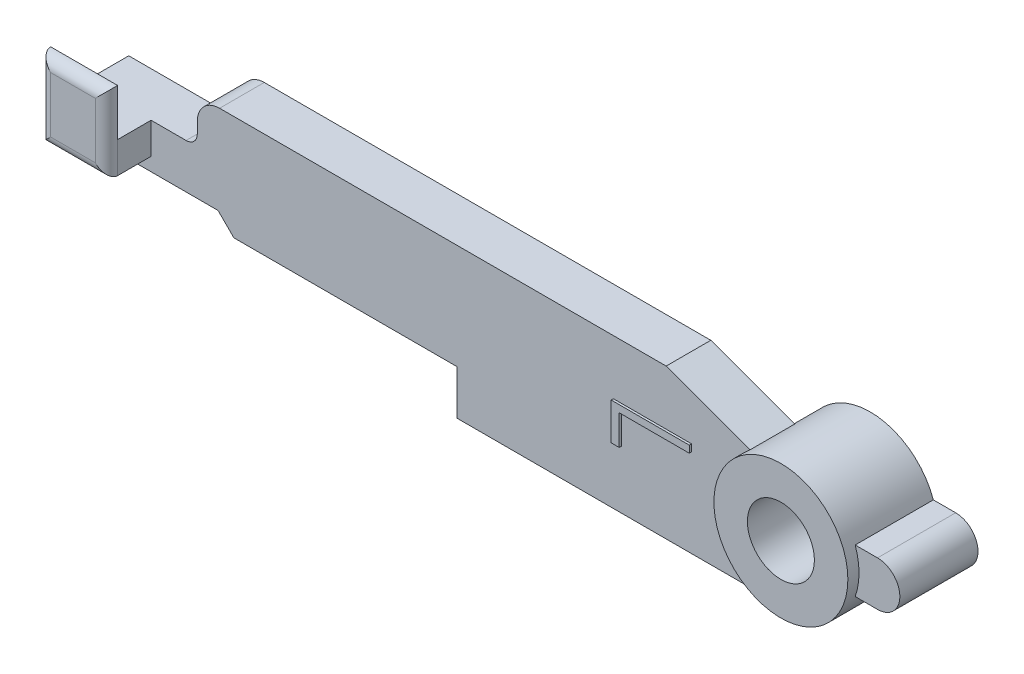
ISO-10303-21;
HEADER;
FILE_DESCRIPTION(('STEP AP214'),'2;1');
FILE_NAME('part.step','',(''),(''),'','','');
FILE_SCHEMA(('AUTOMOTIVE_DESIGN { 1 0 10303 214 1 1 1 1 }'));
ENDSEC;
DATA;
#1=APPLICATION_CONTEXT('core data for automotive mechanical design processes');
#2=APPLICATION_PROTOCOL_DEFINITION('international standard','automotive_design',2000,#1);
#3=PRODUCT_CONTEXT('',#1,'mechanical');
#4=PRODUCT('Part','Part','',(#3));
#5=PRODUCT_RELATED_PRODUCT_CATEGORY('part','',(#4));
#6=PRODUCT_DEFINITION_FORMATION('','',#4);
#7=PRODUCT_DEFINITION_CONTEXT('part definition',#1,'design');
#8=PRODUCT_DEFINITION('design','',#6,#7);
#9=PRODUCT_DEFINITION_SHAPE('','',#8);
#10=(LENGTH_UNIT() NAMED_UNIT(*) SI_UNIT(.MILLI.,.METRE.));
#11=(NAMED_UNIT(*) PLANE_ANGLE_UNIT() SI_UNIT($,.RADIAN.));
#12=(NAMED_UNIT(*) SI_UNIT($,.STERADIAN.) SOLID_ANGLE_UNIT());
#13=UNCERTAINTY_MEASURE_WITH_UNIT(LENGTH_MEASURE(1.E-05),#10,'distance_accuracy_value','');
#14=(GEOMETRIC_REPRESENTATION_CONTEXT(3) GLOBAL_UNCERTAINTY_ASSIGNED_CONTEXT((#13)) GLOBAL_UNIT_ASSIGNED_CONTEXT((#10,
#11,#12)) REPRESENTATION_CONTEXT('',''));
#15=CARTESIAN_POINT('',(0.,0.,0.));
#16=DIRECTION('',(0.,0.,1.));
#17=DIRECTION('',(1.,0.,0.));
#18=AXIS2_PLACEMENT_3D('',#15,#16,#17);
#19=CARTESIAN_POINT('',(15.,-0.500000000000003,-1.5));
#20=DIRECTION('',(0.,0.,1.));
#21=DIRECTION('',(1.,0.,0.));
#22=AXIS2_PLACEMENT_3D('',#19,#20,#21);
#23=CYLINDRICAL_SURFACE('',#22,3.);
#24=CARTESIAN_POINT('',(15.,-0.500000000000003,2.5));
#25=DIRECTION('',(0.,0.,-1.));
#26=DIRECTION('',(1.,0.,0.));
#27=AXIS2_PLACEMENT_3D('',#24,#25,#26);
#28=CIRCLE('',#27,3.);
#29=CARTESIAN_POINT('',(18.,-0.500000000000003,2.5));
#30=VERTEX_POINT('',#29);
#31=EDGE_CURVE('E334',#30,#30,#28,.T.);
#32=ORIENTED_EDGE('',*,*,#31,.T.);
#33=EDGE_LOOP('',(#32));
#34=FACE_BOUND('',#33,.T.);
#35=CARTESIAN_POINT('',(15.,-0.500000000000003,2.));
#36=DIRECTION('',(0.,0.,1.));
#37=DIRECTION('',(-1.,0.,0.));
#38=AXIS2_PLACEMENT_3D('',#35,#36,#37);
#39=CIRCLE('',#38,3.);
#40=CARTESIAN_POINT('',(13.1211883907892,1.83881742277903,2.));
#41=VERTEX_POINT('',#40);
#42=CARTESIAN_POINT('',(15.,-3.5,2.));
#43=VERTEX_POINT('',#42);
#44=EDGE_CURVE('E354',#41,#43,#39,.T.);
#45=ORIENTED_EDGE('',*,*,#44,.T.);
#46=DIRECTION('',(0.,0.,-1.));
#47=VECTOR('',#46,1.);
#48=CARTESIAN_POINT('',(15.,-3.5,2.));
#49=LINE('',#48,#47);
#50=CARTESIAN_POINT('',(15.,-3.5,0.));
#51=VERTEX_POINT('',#50);
#52=EDGE_CURVE('E428',#43,#51,#49,.T.);
#53=ORIENTED_EDGE('',*,*,#52,.T.);
#54=CARTESIAN_POINT('',(15.,-0.500000000000003,0.));
#55=DIRECTION('',(0.,0.,1.));
#56=DIRECTION('',(-1.,0.,0.));
#57=AXIS2_PLACEMENT_3D('',#54,#55,#56);
#58=CIRCLE('',#57,3.);
#59=CARTESIAN_POINT('',(13.1211883907892,1.83881742277903,0.));
#60=VERTEX_POINT('',#59);
#61=EDGE_CURVE('E457',#60,#51,#58,.T.);
#62=ORIENTED_EDGE('',*,*,#61,.F.);
#63=DIRECTION('',(0.,0.,1.));
#64=VECTOR('',#63,1.);
#65=CARTESIAN_POINT('',(13.1211883907892,1.83881742277903,-1.5));
#66=LINE('',#65,#64);
#67=EDGE_CURVE('E351',#60,#41,#66,.T.);
#68=ORIENTED_EDGE('',*,*,#67,.T.);
#69=EDGE_LOOP('',(#45,#53,#62,#68));
#70=FACE_BOUND('',#69,.T.);
#71=CARTESIAN_POINT('',(15.,-0.500000000000003,2.));
#72=DIRECTION('',(0.,0.,1.));
#73=DIRECTION('',(-1.,0.,0.));
#74=AXIS2_PLACEMENT_3D('',#71,#72,#73);
#75=CIRCLE('',#74,3.);
#76=CARTESIAN_POINT('',(17.8284271247462,0.499999999999998,2.));
#77=VERTEX_POINT('',#76);
#78=CARTESIAN_POINT('',(17.8284271247462,-1.5,2.));
#79=VERTEX_POINT('',#78);
#80=EDGE_CURVE('E331',#77,#79,#75,.F.);
#81=ORIENTED_EDGE('',*,*,#80,.F.);
#82=DIRECTION('',(0.,0.,-1.));
#83=VECTOR('',#82,1.);
#84=CARTESIAN_POINT('',(17.8284271247462,0.499999999999998,4.82842712474619));
#85=LINE('',#84,#83);
#86=CARTESIAN_POINT('',(17.8284271247462,0.499999999999998,-1.5));
#87=VERTEX_POINT('',#86);
#88=EDGE_CURVE('E341',#77,#87,#85,.T.);
#89=ORIENTED_EDGE('',*,*,#88,.T.);
#90=CARTESIAN_POINT('',(15.,-0.500000000000003,-1.5));
#91=DIRECTION('',(0.,0.,-1.));
#92=DIRECTION('',(1.,0.,0.));
#93=AXIS2_PLACEMENT_3D('',#90,#91,#92);
#94=CIRCLE('',#93,3.);
#95=CARTESIAN_POINT('',(17.8284271247462,-1.5,-1.5));
#96=VERTEX_POINT('',#95);
#97=EDGE_CURVE('E348',#96,#87,#94,.T.);
#98=ORIENTED_EDGE('',*,*,#97,.F.);
#99=DIRECTION('',(0.,0.,-1.));
#100=VECTOR('',#99,1.);
#101=CARTESIAN_POINT('',(17.8284271247462,-1.5,4.82842712474619));
#102=LINE('',#101,#100);
#103=EDGE_CURVE('E324',#79,#96,#102,.T.);
#104=ORIENTED_EDGE('',*,*,#103,.F.);
#105=EDGE_LOOP('',(#81,#89,#98,#104));
#106=FACE_BOUND('',#105,.T.);
#107=ADVANCED_FACE('F35',(#34,#70,#106),#23,.T.);
#108=CARTESIAN_POINT('',(-16.7071067811866,1.20710678118654,2.));
#109=DIRECTION('',(1.,0.,0.));
#110=DIRECTION('',(0.,0.,-1.));
#111=AXIS2_PLACEMENT_3D('',#108,#109,#110);
#112=PLANE('',#111);
#113=DIRECTION('',(0.,0.,-1.));
#114=VECTOR('',#113,1.);
#115=CARTESIAN_POINT('',(-16.7071067811866,1.20710678118654,2.));
#116=LINE('',#115,#114);
#117=CARTESIAN_POINT('',(-16.7071067811866,1.20710678118654,3.5));
#118=VERTEX_POINT('',#117);
#119=CARTESIAN_POINT('',(-16.7071067811866,1.20710678118654,0.));
#120=VERTEX_POINT('',#119);
#121=EDGE_CURVE('E434',#118,#120,#116,.T.);
#122=ORIENTED_EDGE('',*,*,#121,.T.);
#123=DIRECTION('',(0.,1.,0.));
#124=VECTOR('',#123,1.);
#125=CARTESIAN_POINT('',(-16.7071067811866,1.20710678118654,0.));
#126=LINE('',#125,#124);
#127=CARTESIAN_POINT('',(-16.7071067811866,-0.792893218813459,0.));
#128=VERTEX_POINT('',#127);
#129=EDGE_CURVE('E357',#128,#120,#126,.T.);
#130=ORIENTED_EDGE('',*,*,#129,.F.);
#131=DIRECTION('',(0.,0.,-1.));
#132=VECTOR('',#131,1.);
#133=CARTESIAN_POINT('',(-16.7071067811866,-0.792893218813459,2.));
#134=LINE('',#133,#132);
#135=CARTESIAN_POINT('',(-16.7071067811866,-0.792893218813459,2.));
#136=VERTEX_POINT('',#135);
#137=EDGE_CURVE('E387',#136,#128,#134,.T.);
#138=ORIENTED_EDGE('',*,*,#137,.F.);
#139=DIRECTION('',(0.,1.,0.));
#140=VECTOR('',#139,1.);
#141=CARTESIAN_POINT('',(-16.7071067811866,1.20710678118654,2.));
#142=LINE('',#141,#140);
#143=CARTESIAN_POINT('',(-16.7071067811866,-0.192893218813459,2.));
#144=VERTEX_POINT('',#143);
#145=EDGE_CURVE('E358',#136,#144,#142,.T.);
#146=ORIENTED_EDGE('',*,*,#145,.T.);
#147=DIRECTION('',(0.,0.,-1.));
#148=VECTOR('',#147,1.);
#149=CARTESIAN_POINT('',(-16.7071067811866,-0.192893218813459,4.));
#150=LINE('',#149,#148);
#151=CARTESIAN_POINT('',(-16.7071067811866,-0.192893218813459,3.5));
#152=VERTEX_POINT('',#151);
#153=EDGE_CURVE('E295',#152,#144,#150,.T.);
#154=ORIENTED_EDGE('',*,*,#153,.F.);
#155=DIRECTION('',(0.,-1.,0.));
#156=VECTOR('',#155,1.);
#157=CARTESIAN_POINT('',(-16.7071067811866,-0.192893218813459,3.5));
#158=LINE('',#157,#156);
#159=EDGE_CURVE('E11',#118,#152,#158,.T.);
#160=ORIENTED_EDGE('',*,*,#159,.F.);
#161=EDGE_LOOP('',(#122,#130,#138,#146,#154,#160));
#162=FACE_BOUND('',#161,.T.);
#163=ADVANCED_FACE('F512',(#162),#112,.F.);
#164=CARTESIAN_POINT('',(-11.6381557247154,1.20710678118654,2.));
#165=DIRECTION('',(0.,-1.,0.));
#166=DIRECTION('',(-1.,0.,0.));
#167=AXIS2_PLACEMENT_3D('',#164,#165,#166);
#168=PLANE('',#167);
#169=DIRECTION('',(1.,0.,0.));
#170=VECTOR('',#169,1.);
#171=CARTESIAN_POINT('',(-11.6381557247154,1.20710678118654,0.));
#172=LINE('',#171,#170);
#173=CARTESIAN_POINT('',(-12.1381557247154,1.20710678118654,0.));
#174=VERTEX_POINT('',#173);
#175=EDGE_CURVE('E390',#120,#174,#172,.T.);
#176=ORIENTED_EDGE('',*,*,#175,.F.);
#177=ORIENTED_EDGE('',*,*,#121,.F.);
#178=DIRECTION('',(-1.,0.,0.));
#179=VECTOR('',#178,1.);
#180=CARTESIAN_POINT('',(-13.7071067811866,1.20710678118654,3.5));
#181=LINE('',#180,#179);
#182=CARTESIAN_POINT('',(-13.7071067811866,1.20710678118654,3.5));
#183=VERTEX_POINT('',#182);
#184=EDGE_CURVE('E303',#183,#118,#181,.T.);
#185=ORIENTED_EDGE('',*,*,#184,.F.);
#186=DIRECTION('',(0.,0.,1.));
#187=VECTOR('',#186,1.);
#188=CARTESIAN_POINT('',(-13.7071067811866,1.20710678118654,2.));
#189=LINE('',#188,#187);
#190=CARTESIAN_POINT('',(-13.7071067811866,1.20710678118654,2.));
#191=VERTEX_POINT('',#190);
#192=EDGE_CURVE('E294',#191,#183,#189,.T.);
#193=ORIENTED_EDGE('',*,*,#192,.F.);
#194=DIRECTION('',(1.,0.,0.));
#195=VECTOR('',#194,1.);
#196=CARTESIAN_POINT('',(-11.6381557247154,1.20710678118654,2.));
#197=LINE('',#196,#195);
#198=CARTESIAN_POINT('',(-12.1381557247154,1.20710678118654,2.));
#199=VERTEX_POINT('',#198);
#200=EDGE_CURVE('E361',#191,#199,#197,.T.);
#201=ORIENTED_EDGE('',*,*,#200,.T.);
#202=DIRECTION('',(0.,0.,-1.));
#203=VECTOR('',#202,1.);
#204=CARTESIAN_POINT('',(-12.1381557247154,1.20710678118654,2.));
#205=LINE('',#204,#203);
#206=EDGE_CURVE('E450',#174,#199,#205,.F.);
#207=ORIENTED_EDGE('',*,*,#206,.F.);
#208=EDGE_LOOP('',(#176,#177,#185,#193,#201,#207));
#209=FACE_BOUND('',#208,.T.);
#210=ADVANCED_FACE('F508',(#209),#168,.F.);
#211=CARTESIAN_POINT('',(-11.6381557247154,3.20710678118654,2.));
#212=DIRECTION('',(1.,0.,0.));
#213=DIRECTION('',(0.,-1.,0.));
#214=AXIS2_PLACEMENT_3D('',#211,#212,#213);
#215=PLANE('',#214);
#216=DIRECTION('',(0.,1.,0.));
#217=VECTOR('',#216,1.);
#218=CARTESIAN_POINT('',(-11.6381557247154,3.20710678118654,2.));
#219=LINE('',#218,#217);
#220=CARTESIAN_POINT('',(-11.6381557247154,1.70710678118654,2.));
#221=VERTEX_POINT('',#220);
#222=CARTESIAN_POINT('',(-11.6381557247154,2.20710678118654,2.));
#223=VERTEX_POINT('',#222);
#224=EDGE_CURVE('E365',#221,#223,#219,.T.);
#225=ORIENTED_EDGE('',*,*,#224,.T.);
#226=DIRECTION('',(0.,0.,-1.));
#227=VECTOR('',#226,1.);
#228=CARTESIAN_POINT('',(-11.6381557247154,2.20710678118654,2.));
#229=LINE('',#228,#227);
#230=CARTESIAN_POINT('',(-11.6381557247154,2.20710678118654,0.));
#231=VERTEX_POINT('',#230);
#232=EDGE_CURVE('E442',#231,#223,#229,.F.);
#233=ORIENTED_EDGE('',*,*,#232,.F.);
#234=DIRECTION('',(0.,1.,0.));
#235=VECTOR('',#234,1.);
#236=CARTESIAN_POINT('',(-11.6381557247154,3.20710678118654,0.));
#237=LINE('',#236,#235);
#238=CARTESIAN_POINT('',(-11.6381557247154,1.70710678118654,0.));
#239=VERTEX_POINT('',#238);
#240=EDGE_CURVE('E393',#239,#231,#237,.T.);
#241=ORIENTED_EDGE('',*,*,#240,.F.);
#242=DIRECTION('',(0.,0.,-1.));
#243=VECTOR('',#242,1.);
#244=CARTESIAN_POINT('',(-11.6381557247154,1.70710678118654,0.));
#245=LINE('',#244,#243);
#246=EDGE_CURVE('E447',#221,#239,#245,.T.);
#247=ORIENTED_EDGE('',*,*,#246,.F.);
#248=EDGE_LOOP('',(#225,#233,#241,#247));
#249=FACE_BOUND('',#248,.T.);
#250=ADVANCED_FACE('F555',(#249),#215,.F.);
#251=CARTESIAN_POINT('',(9.36184427528456,3.20710678118654,2.));
#252=DIRECTION('',(0.,-1.,0.));
#253=DIRECTION('',(-1.,0.,0.));
#254=AXIS2_PLACEMENT_3D('',#251,#252,#253);
#255=PLANE('',#254);
#256=DIRECTION('',(1.,0.,0.));
#257=VECTOR('',#256,1.);
#258=CARTESIAN_POINT('',(9.36184427528456,3.20710678118654,2.));
#259=LINE('',#258,#257);
#260=CARTESIAN_POINT('',(-10.6381557247154,3.20710678118654,2.));
#261=VERTEX_POINT('',#260);
#262=CARTESIAN_POINT('',(9.36184427528456,3.20710678118654,2.));
#263=VERTEX_POINT('',#262);
#264=EDGE_CURVE('E368',#261,#263,#259,.T.);
#265=ORIENTED_EDGE('',*,*,#264,.T.);
#266=DIRECTION('',(0.,0.,-1.));
#267=VECTOR('',#266,1.);
#268=CARTESIAN_POINT('',(9.36184427528456,3.20710678118654,2.));
#269=LINE('',#268,#267);
#270=CARTESIAN_POINT('',(9.36184427528456,3.20710678118654,0.));
#271=VERTEX_POINT('',#270);
#272=EDGE_CURVE('E431',#263,#271,#269,.T.);
#273=ORIENTED_EDGE('',*,*,#272,.T.);
#274=DIRECTION('',(1.,0.,0.));
#275=VECTOR('',#274,1.);
#276=CARTESIAN_POINT('',(9.36184427528456,3.20710678118654,0.));
#277=LINE('',#276,#275);
#278=CARTESIAN_POINT('',(-10.6381557247154,3.20710678118654,0.));
#279=VERTEX_POINT('',#278);
#280=EDGE_CURVE('E396',#279,#271,#277,.T.);
#281=ORIENTED_EDGE('',*,*,#280,.F.);
#282=DIRECTION('',(0.,0.,-1.));
#283=VECTOR('',#282,1.);
#284=CARTESIAN_POINT('',(-10.6381557247154,3.20710678118654,2.));
#285=LINE('',#284,#283);
#286=EDGE_CURVE('E437',#261,#279,#285,.T.);
#287=ORIENTED_EDGE('',*,*,#286,.F.);
#288=EDGE_LOOP('',(#265,#273,#281,#287));
#289=FACE_BOUND('',#288,.T.);
#290=ADVANCED_FACE('F548',(#289),#255,.F.);
#291=CARTESIAN_POINT('',(15.,1.15498592123252,2.));
#292=DIRECTION('',(-0.34202014332567,-0.939692620785908,0.));
#293=DIRECTION('',(-0.939692620785908,0.34202014332567,0.));
#294=AXIS2_PLACEMENT_3D('',#291,#292,#293);
#295=PLANE('',#294);
#296=DIRECTION('',(0.939692620785908,-0.34202014332567,0.));
#297=VECTOR('',#296,1.);
#298=CARTESIAN_POINT('',(15.,1.15498592123252,0.));
#299=LINE('',#298,#297);
#300=EDGE_CURVE('E399',#271,#60,#299,.T.);
#301=ORIENTED_EDGE('',*,*,#300,.F.);
#302=ORIENTED_EDGE('',*,*,#272,.F.);
#303=DIRECTION('',(0.939692620785908,-0.34202014332567,0.));
#304=VECTOR('',#303,1.);
#305=CARTESIAN_POINT('',(15.,1.15498592123252,2.));
#306=LINE('',#305,#304);
#307=EDGE_CURVE('E371',#263,#41,#306,.T.);
#308=ORIENTED_EDGE('',*,*,#307,.T.);
#309=ORIENTED_EDGE('',*,*,#67,.F.);
#310=EDGE_LOOP('',(#301,#302,#308,#309));
#311=FACE_BOUND('',#310,.T.);
#312=ADVANCED_FACE('F544',(#311),#295,.F.);
#313=CARTESIAN_POINT('',(0.,-3.5,2.));
#314=DIRECTION('',(0.,1.,0.));
#315=DIRECTION('',(1.,0.,0.));
#316=AXIS2_PLACEMENT_3D('',#313,#314,#315);
#317=PLANE('',#316);
#318=DIRECTION('',(-1.,0.,0.));
#319=VECTOR('',#318,1.);
#320=CARTESIAN_POINT('',(0.,-3.5,0.));
#321=LINE('',#320,#319);
#322=CARTESIAN_POINT('',(0.,-3.5,0.));
#323=VERTEX_POINT('',#322);
#324=EDGE_CURVE('E401',#51,#323,#321,.T.);
#325=ORIENTED_EDGE('',*,*,#324,.F.);
#326=ORIENTED_EDGE('',*,*,#52,.F.);
#327=DIRECTION('',(-1.,0.,0.));
#328=VECTOR('',#327,1.);
#329=CARTESIAN_POINT('',(0.,-3.5,2.));
#330=LINE('',#329,#328);
#331=CARTESIAN_POINT('',(0.,-3.5,2.));
#332=VERTEX_POINT('',#331);
#333=EDGE_CURVE('E373',#43,#332,#330,.T.);
#334=ORIENTED_EDGE('',*,*,#333,.T.);
#335=DIRECTION('',(0.,0.,-1.));
#336=VECTOR('',#335,1.);
#337=CARTESIAN_POINT('',(0.,-3.5,2.));
#338=LINE('',#337,#336);
#339=EDGE_CURVE('E425',#332,#323,#338,.T.);
#340=ORIENTED_EDGE('',*,*,#339,.T.);
#341=EDGE_LOOP('',(#325,#326,#334,#340));
#342=FACE_BOUND('',#341,.T.);
#343=ADVANCED_FACE('F535',(#342),#317,.F.);
#344=CARTESIAN_POINT('',(0.,-1.5,2.));
#345=DIRECTION('',(1.,0.,0.));
#346=DIRECTION('',(0.,-1.,0.));
#347=AXIS2_PLACEMENT_3D('',#344,#345,#346);
#348=PLANE('',#347);
#349=DIRECTION('',(0.,1.,0.));
#350=VECTOR('',#349,1.);
#351=CARTESIAN_POINT('',(0.,-1.5,0.));
#352=LINE('',#351,#350);
#353=CARTESIAN_POINT('',(0.,-1.5,0.));
#354=VERTEX_POINT('',#353);
#355=EDGE_CURVE('E404',#323,#354,#352,.T.);
#356=ORIENTED_EDGE('',*,*,#355,.F.);
#357=ORIENTED_EDGE('',*,*,#339,.F.);
#358=DIRECTION('',(0.,1.,0.));
#359=VECTOR('',#358,1.);
#360=CARTESIAN_POINT('',(0.,-1.5,2.));
#361=LINE('',#360,#359);
#362=CARTESIAN_POINT('',(0.,-1.5,2.));
#363=VERTEX_POINT('',#362);
#364=EDGE_CURVE('E376',#332,#363,#361,.T.);
#365=ORIENTED_EDGE('',*,*,#364,.T.);
#366=DIRECTION('',(0.,0.,-1.));
#367=VECTOR('',#366,1.);
#368=CARTESIAN_POINT('',(0.,-1.5,2.));
#369=LINE('',#368,#367);
#370=EDGE_CURVE('E422',#363,#354,#369,.T.);
#371=ORIENTED_EDGE('',*,*,#370,.T.);
#372=EDGE_LOOP('',(#356,#357,#365,#371));
#373=FACE_BOUND('',#372,.T.);
#374=ADVANCED_FACE('F532',(#373),#348,.F.);
#375=CARTESIAN_POINT('',(-10.,-1.5,2.));
#376=DIRECTION('',(0.,1.,0.));
#377=DIRECTION('',(0.,0.,-1.));
#378=AXIS2_PLACEMENT_3D('',#375,#376,#377);
#379=PLANE('',#378);
#380=DIRECTION('',(-1.,0.,0.));
#381=VECTOR('',#380,1.);
#382=CARTESIAN_POINT('',(-10.,-1.5,0.));
#383=LINE('',#382,#381);
#384=CARTESIAN_POINT('',(-10.,-1.5,0.));
#385=VERTEX_POINT('',#384);
#386=EDGE_CURVE('E407',#354,#385,#383,.T.);
#387=ORIENTED_EDGE('',*,*,#386,.F.);
#388=ORIENTED_EDGE('',*,*,#370,.F.);
#389=DIRECTION('',(-1.,0.,0.));
#390=VECTOR('',#389,1.);
#391=CARTESIAN_POINT('',(-10.,-1.5,2.));
#392=LINE('',#391,#390);
#393=CARTESIAN_POINT('',(-10.,-1.5,2.));
#394=VERTEX_POINT('',#393);
#395=EDGE_CURVE('E379',#363,#394,#392,.T.);
#396=ORIENTED_EDGE('',*,*,#395,.T.);
#397=DIRECTION('',(0.,0.,-1.));
#398=VECTOR('',#397,1.);
#399=CARTESIAN_POINT('',(-10.,-1.5,2.));
#400=LINE('',#399,#398);
#401=EDGE_CURVE('E419',#394,#385,#400,.T.);
#402=ORIENTED_EDGE('',*,*,#401,.T.);
#403=EDGE_LOOP('',(#387,#388,#396,#402));
#404=FACE_BOUND('',#403,.T.);
#405=ADVANCED_FACE('F530',(#404),#379,.F.);
#406=CARTESIAN_POINT('',(-10.7071067811865,-0.792893218813459,2.));
#407=DIRECTION('',(0.707106781186544,0.707106781186551,0.));
#408=DIRECTION('',(0.707106781186551,-0.707106781186544,0.));
#409=AXIS2_PLACEMENT_3D('',#406,#407,#408);
#410=PLANE('',#409);
#411=DIRECTION('',(-0.707106781186551,0.707106781186544,0.));
#412=VECTOR('',#411,1.);
#413=CARTESIAN_POINT('',(-10.7071067811865,-0.792893218813459,0.));
#414=LINE('',#413,#412);
#415=CARTESIAN_POINT('',(-10.7071067811865,-0.792893218813459,0.));
#416=VERTEX_POINT('',#415);
#417=EDGE_CURVE('E410',#385,#416,#414,.T.);
#418=ORIENTED_EDGE('',*,*,#417,.F.);
#419=ORIENTED_EDGE('',*,*,#401,.F.);
#420=DIRECTION('',(-0.707106781186551,0.707106781186544,0.));
#421=VECTOR('',#420,1.);
#422=CARTESIAN_POINT('',(-10.7071067811865,-0.792893218813459,2.));
#423=LINE('',#422,#421);
#424=CARTESIAN_POINT('',(-10.7071067811865,-0.792893218813459,2.));
#425=VERTEX_POINT('',#424);
#426=EDGE_CURVE('E382',#394,#425,#423,.T.);
#427=ORIENTED_EDGE('',*,*,#426,.T.);
#428=DIRECTION('',(0.,0.,-1.));
#429=VECTOR('',#428,1.);
#430=CARTESIAN_POINT('',(-10.7071067811865,-0.792893218813459,2.));
#431=LINE('',#430,#429);
#432=EDGE_CURVE('E416',#425,#416,#431,.T.);
#433=ORIENTED_EDGE('',*,*,#432,.T.);
#434=EDGE_LOOP('',(#418,#419,#427,#433));
#435=FACE_BOUND('',#434,.T.);
#436=ADVANCED_FACE('F526',(#435),#410,.F.);
#437=CARTESIAN_POINT('',(-16.7071067811866,-0.792893218813459,2.));
#438=DIRECTION('',(0.,1.,0.));
#439=DIRECTION('',(1.,0.,0.));
#440=AXIS2_PLACEMENT_3D('',#437,#438,#439);
#441=PLANE('',#440);
#442=DIRECTION('',(-1.,0.,0.));
#443=VECTOR('',#442,1.);
#444=CARTESIAN_POINT('',(-16.7071067811866,-0.792893218813459,0.));
#445=LINE('',#444,#443);
#446=EDGE_CURVE('E362',#416,#128,#445,.T.);
#447=ORIENTED_EDGE('',*,*,#446,.F.);
#448=ORIENTED_EDGE('',*,*,#432,.F.);
#449=DIRECTION('',(-1.,0.,0.));
#450=VECTOR('',#449,1.);
#451=CARTESIAN_POINT('',(-16.7071067811866,-0.792893218813459,2.));
#452=LINE('',#451,#450);
#453=EDGE_CURVE('E385',#425,#136,#452,.T.);
#454=ORIENTED_EDGE('',*,*,#453,.T.);
#455=ORIENTED_EDGE('',*,*,#137,.T.);
#456=EDGE_LOOP('',(#447,#448,#454,#455));
#457=FACE_BOUND('',#456,.T.);
#458=ADVANCED_FACE('F523',(#457),#441,.F.);
#459=CARTESIAN_POINT('',(0.,0.,2.));
#460=DIRECTION('',(0.,0.,-1.));
#461=DIRECTION('',(-1.,0.,0.));
#462=AXIS2_PLACEMENT_3D('',#459,#460,#461);
#463=PLANE('',#462);
#464=DIRECTION('',(0.,1.,0.));
#465=VECTOR('',#464,1.);
#466=CARTESIAN_POINT('',(7.,-0.901867577787817,2.));
#467=LINE('',#466,#465);
#468=CARTESIAN_POINT('',(7.,-0.901867577787817,2.));
#469=VERTEX_POINT('',#468);
#470=CARTESIAN_POINT('',(7.,0.758388832468593,2.));
#471=VERTEX_POINT('',#470);
#472=EDGE_CURVE('E254',#469,#471,#467,.T.);
#473=ORIENTED_EDGE('',*,*,#472,.T.);
#474=DIRECTION('',(1.,0.,0.));
#475=VECTOR('',#474,1.);
#476=CARTESIAN_POINT('',(7.,0.758388832468593,2.));
#477=LINE('',#476,#475);
#478=CARTESIAN_POINT('',(10.5,0.758388832468593,2.));
#479=VERTEX_POINT('',#478);
#480=EDGE_CURVE('E268',#471,#479,#477,.T.);
#481=ORIENTED_EDGE('',*,*,#480,.T.);
#482=DIRECTION('',(0.,-1.,0.));
#483=VECTOR('',#482,1.);
#484=CARTESIAN_POINT('',(10.5,0.758388832468593,2.));
#485=LINE('',#484,#483);
#486=CARTESIAN_POINT('',(10.5,0.444286268366029,2.));
#487=VERTEX_POINT('',#486);
#488=EDGE_CURVE('E233',#479,#487,#485,.T.);
#489=ORIENTED_EDGE('',*,*,#488,.T.);
#490=DIRECTION('',(-1.,0.,0.));
#491=VECTOR('',#490,1.);
#492=CARTESIAN_POINT('',(10.5,0.444286268366029,2.));
#493=LINE('',#492,#491);
#494=CARTESIAN_POINT('',(7.35897435897436,0.444286268366029,2.));
#495=VERTEX_POINT('',#494);
#496=EDGE_CURVE('E52',#487,#495,#493,.T.);
#497=ORIENTED_EDGE('',*,*,#496,.T.);
#498=DIRECTION('',(0.,-1.,0.));
#499=VECTOR('',#498,1.);
#500=CARTESIAN_POINT('',(7.35897435897436,0.444286268366029,2.));
#501=LINE('',#500,#499);
#502=CARTESIAN_POINT('',(7.35897435897436,-0.901867577787817,2.));
#503=VERTEX_POINT('',#502);
#504=EDGE_CURVE('E272',#495,#503,#501,.T.);
#505=ORIENTED_EDGE('',*,*,#504,.T.);
#506=DIRECTION('',(-1.,0.,0.));
#507=VECTOR('',#506,1.);
#508=CARTESIAN_POINT('',(7.35897435897436,-0.901867577787817,2.));
#509=LINE('',#508,#507);
#510=EDGE_CURVE('E257',#503,#469,#509,.T.);
#511=ORIENTED_EDGE('',*,*,#510,.T.);
#512=EDGE_LOOP('',(#473,#481,#489,#497,#505,#511));
#513=FACE_BOUND('',#512,.T.);
#514=ORIENTED_EDGE('',*,*,#145,.F.);
#515=ORIENTED_EDGE('',*,*,#453,.F.);
#516=ORIENTED_EDGE('',*,*,#426,.F.);
#517=ORIENTED_EDGE('',*,*,#395,.F.);
#518=ORIENTED_EDGE('',*,*,#364,.F.);
#519=ORIENTED_EDGE('',*,*,#333,.F.);
#520=ORIENTED_EDGE('',*,*,#44,.F.);
#521=ORIENTED_EDGE('',*,*,#307,.F.);
#522=ORIENTED_EDGE('',*,*,#264,.F.);
#523=CARTESIAN_POINT('',(-10.6381557247154,2.20710678118654,2.));
#524=DIRECTION('',(0.,0.,1.));
#525=DIRECTION('',(-1.,0.,0.));
#526=AXIS2_PLACEMENT_3D('',#523,#524,#525);
#527=CIRCLE('',#526,1.);
#528=EDGE_CURVE('E445',#223,#261,#527,.F.);
#529=ORIENTED_EDGE('',*,*,#528,.F.);
#530=ORIENTED_EDGE('',*,*,#224,.F.);
#531=CARTESIAN_POINT('',(-12.1381557247154,1.70710678118654,2.));
#532=DIRECTION('',(0.,0.,1.));
#533=DIRECTION('',(-1.,0.,0.));
#534=AXIS2_PLACEMENT_3D('',#531,#532,#533);
#535=CIRCLE('',#534,0.5);
#536=EDGE_CURVE('E455',#199,#221,#535,.T.);
#537=ORIENTED_EDGE('',*,*,#536,.F.);
#538=ORIENTED_EDGE('',*,*,#200,.F.);
#539=DIRECTION('',(0.,1.,0.));
#540=VECTOR('',#539,1.);
#541=CARTESIAN_POINT('',(-13.7071067811866,-0.192893218813458,2.));
#542=LINE('',#541,#540);
#543=CARTESIAN_POINT('',(-13.7071067811866,-0.192893218813459,2.));
#544=VERTEX_POINT('',#543);
#545=EDGE_CURVE('E292',#544,#191,#542,.T.);
#546=ORIENTED_EDGE('',*,*,#545,.F.);
#547=DIRECTION('',(-1.,0.,0.));
#548=VECTOR('',#547,1.);
#549=CARTESIAN_POINT('',(-13.7071067811866,-0.192893218813458,2.));
#550=LINE('',#549,#548);
#551=EDGE_CURVE('E309',#544,#144,#550,.T.);
#552=ORIENTED_EDGE('',*,*,#551,.T.);
#553=EDGE_LOOP('',(#514,#515,#516,#517,#518,#519,#520,#521,#522,#529,#530,#537,#538,#546,#552));
#554=FACE_BOUND('',#553,.T.);
#555=ADVANCED_FACE('F516',(#513,#554),#463,.F.);
#556=CARTESIAN_POINT('',(0.,0.,0.));
#557=DIRECTION('',(0.,0.,-1.));
#558=DIRECTION('',(-1.,0.,0.));
#559=AXIS2_PLACEMENT_3D('',#556,#557,#558);
#560=PLANE('',#559);
#561=ORIENTED_EDGE('',*,*,#61,.T.);
#562=ORIENTED_EDGE('',*,*,#324,.T.);
#563=ORIENTED_EDGE('',*,*,#355,.T.);
#564=ORIENTED_EDGE('',*,*,#386,.T.);
#565=ORIENTED_EDGE('',*,*,#417,.T.);
#566=ORIENTED_EDGE('',*,*,#446,.T.);
#567=ORIENTED_EDGE('',*,*,#129,.T.);
#568=ORIENTED_EDGE('',*,*,#175,.T.);
#569=CARTESIAN_POINT('',(-12.1381557247154,1.70710678118654,0.));
#570=DIRECTION('',(0.,0.,1.));
#571=DIRECTION('',(-1.,0.,0.));
#572=AXIS2_PLACEMENT_3D('',#569,#570,#571);
#573=CIRCLE('',#572,0.5);
#574=EDGE_CURVE('E453',#239,#174,#573,.F.);
#575=ORIENTED_EDGE('',*,*,#574,.F.);
#576=ORIENTED_EDGE('',*,*,#240,.T.);
#577=CARTESIAN_POINT('',(-10.6381557247154,2.20710678118654,0.));
#578=DIRECTION('',(0.,0.,1.));
#579=DIRECTION('',(-1.,0.,0.));
#580=AXIS2_PLACEMENT_3D('',#577,#578,#579);
#581=CIRCLE('',#580,1.);
#582=EDGE_CURVE('E440',#279,#231,#581,.T.);
#583=ORIENTED_EDGE('',*,*,#582,.F.);
#584=ORIENTED_EDGE('',*,*,#280,.T.);
#585=ORIENTED_EDGE('',*,*,#300,.T.);
#586=EDGE_LOOP('',(#561,#562,#563,#564,#565,#566,#567,#568,#575,#576,#583,#584,#585));
#587=FACE_BOUND('',#586,.T.);
#588=ADVANCED_FACE('F521',(#587),#560,.T.);
#589=CARTESIAN_POINT('',(-10.6381557247154,2.20710678118654,2.));
#590=DIRECTION('',(0.,0.,-1.));
#591=DIRECTION('',(-1.,0.,0.));
#592=AXIS2_PLACEMENT_3D('',#589,#590,#591);
#593=CYLINDRICAL_SURFACE('',#592,1.);
#594=ORIENTED_EDGE('',*,*,#528,.T.);
#595=ORIENTED_EDGE('',*,*,#286,.T.);
#596=ORIENTED_EDGE('',*,*,#582,.T.);
#597=ORIENTED_EDGE('',*,*,#232,.T.);
#598=EDGE_LOOP('',(#594,#595,#596,#597));
#599=FACE_BOUND('',#598,.T.);
#600=ADVANCED_FACE('F551',(#599),#593,.T.);
#601=CARTESIAN_POINT('',(-12.1381557247154,1.70710678118654,2.));
#602=DIRECTION('',(0.,0.,1.));
#603=DIRECTION('',(1.,0.,0.));
#604=AXIS2_PLACEMENT_3D('',#601,#602,#603);
#605=CYLINDRICAL_SURFACE('',#604,0.5);
#606=ORIENTED_EDGE('',*,*,#536,.T.);
#607=ORIENTED_EDGE('',*,*,#246,.T.);
#608=ORIENTED_EDGE('',*,*,#574,.T.);
#609=ORIENTED_EDGE('',*,*,#206,.T.);
#610=EDGE_LOOP('',(#606,#607,#608,#609));
#611=FACE_BOUND('',#610,.T.);
#612=ADVANCED_FACE('F556',(#611),#605,.F.);
#613=CARTESIAN_POINT('',(15.,-0.500000000000003,-1.5));
#614=DIRECTION('',(0.,0.,1.));
#615=DIRECTION('',(1.,0.,0.));
#616=AXIS2_PLACEMENT_3D('',#613,#614,#615);
#617=PLANE('',#616);
#618=CARTESIAN_POINT('',(15.,-0.500000000000003,-1.5));
#619=DIRECTION('',(0.,0.,-1.));
#620=DIRECTION('',(1.,0.,0.));
#621=AXIS2_PLACEMENT_3D('',#618,#619,#620);
#622=CIRCLE('',#621,1.5);
#623=CARTESIAN_POINT('',(16.5,-0.500000000000003,-1.5));
#624=VERTEX_POINT('',#623);
#625=EDGE_CURVE('E286',#624,#624,#622,.T.);
#626=ORIENTED_EDGE('',*,*,#625,.F.);
#627=EDGE_LOOP('',(#626));
#628=FACE_BOUND('',#627,.T.);
#629=ORIENTED_EDGE('',*,*,#97,.T.);
#630=DIRECTION('',(-1.,0.,0.));
#631=VECTOR('',#630,1.);
#632=CARTESIAN_POINT('',(18.8284271247462,0.499999999999997,-1.5));
#633=LINE('',#632,#631);
#634=CARTESIAN_POINT('',(18.8284271247462,0.499999999999997,-1.5));
#635=VERTEX_POINT('',#634);
#636=EDGE_CURVE('E322',#635,#87,#633,.T.);
#637=ORIENTED_EDGE('',*,*,#636,.F.);
#638=CARTESIAN_POINT('',(18.8284271247462,-0.500000000000003,-1.5));
#639=DIRECTION('',(0.,0.,-1.));
#640=DIRECTION('',(1.,0.,0.));
#641=AXIS2_PLACEMENT_3D('',#638,#639,#640);
#642=CIRCLE('',#641,1.);
#643=CARTESIAN_POINT('',(18.8284271247462,-1.5,-1.5));
#644=VERTEX_POINT('',#643);
#645=EDGE_CURVE('E311',#644,#635,#642,.F.);
#646=ORIENTED_EDGE('',*,*,#645,.F.);
#647=DIRECTION('',(1.,0.,0.));
#648=VECTOR('',#647,1.);
#649=CARTESIAN_POINT('',(18.8284271247462,-1.5,-1.5));
#650=LINE('',#649,#648);
#651=EDGE_CURVE('E319',#96,#644,#650,.T.);
#652=ORIENTED_EDGE('',*,*,#651,.F.);
#653=EDGE_LOOP('',(#629,#637,#646,#652));
#654=FACE_BOUND('',#653,.T.);
#655=ADVANCED_FACE('F558',(#628,#654),#617,.F.);
#656=CARTESIAN_POINT('',(15.,-0.500000000000003,2.5));
#657=DIRECTION('',(0.,0.,1.));
#658=DIRECTION('',(1.,0.,0.));
#659=AXIS2_PLACEMENT_3D('',#656,#657,#658);
#660=PLANE('',#659);
#661=CARTESIAN_POINT('',(15.,-0.500000000000003,2.5));
#662=DIRECTION('',(0.,0.,-1.));
#663=DIRECTION('',(1.,0.,0.));
#664=AXIS2_PLACEMENT_3D('',#661,#662,#663);
#665=CIRCLE('',#664,1.5);
#666=CARTESIAN_POINT('',(16.5,-0.500000000000003,2.5));
#667=VERTEX_POINT('',#666);
#668=EDGE_CURVE('E278',#667,#667,#665,.T.);
#669=ORIENTED_EDGE('',*,*,#668,.T.);
#670=EDGE_LOOP('',(#669));
#671=FACE_BOUND('',#670,.T.);
#672=ORIENTED_EDGE('',*,*,#31,.F.);
#673=EDGE_LOOP('',(#672));
#674=FACE_BOUND('',#673,.T.);
#675=ADVANCED_FACE('F564',(#671,#674),#660,.T.);
#676=CARTESIAN_POINT('',(18.8284271247462,-1.5,4.82842712474619));
#677=DIRECTION('',(0.,1.,0.));
#678=DIRECTION('',(1.,0.,0.));
#679=AXIS2_PLACEMENT_3D('',#676,#677,#678);
#680=PLANE('',#679);
#681=ORIENTED_EDGE('',*,*,#103,.T.);
#682=ORIENTED_EDGE('',*,*,#651,.T.);
#683=DIRECTION('',(0.,0.,-1.));
#684=VECTOR('',#683,1.);
#685=CARTESIAN_POINT('',(18.8284271247462,-1.5,4.82842712474619));
#686=LINE('',#685,#684);
#687=CARTESIAN_POINT('',(18.8284271247462,-1.5,2.));
#688=VERTEX_POINT('',#687);
#689=EDGE_CURVE('E337',#688,#644,#686,.T.);
#690=ORIENTED_EDGE('',*,*,#689,.F.);
#691=DIRECTION('',(1.,0.,0.));
#692=VECTOR('',#691,1.);
#693=CARTESIAN_POINT('',(18.8284271247462,-1.5,2.));
#694=LINE('',#693,#692);
#695=EDGE_CURVE('E329',#79,#688,#694,.T.);
#696=ORIENTED_EDGE('',*,*,#695,.F.);
#697=EDGE_LOOP('',(#681,#682,#690,#696));
#698=FACE_BOUND('',#697,.T.);
#699=ADVANCED_FACE('F670',(#698),#680,.F.);
#700=CARTESIAN_POINT('',(18.8284271247462,-0.500000000000003,4.82842712474619));
#701=DIRECTION('',(0.,0.,-1.));
#702=DIRECTION('',(-1.,0.,0.));
#703=AXIS2_PLACEMENT_3D('',#700,#701,#702);
#704=CYLINDRICAL_SURFACE('',#703,1.);
#705=ORIENTED_EDGE('',*,*,#689,.T.);
#706=ORIENTED_EDGE('',*,*,#645,.T.);
#707=DIRECTION('',(0.,0.,-1.));
#708=VECTOR('',#707,1.);
#709=CARTESIAN_POINT('',(18.8284271247462,0.499999999999997,4.82842712474619));
#710=LINE('',#709,#708);
#711=CARTESIAN_POINT('',(18.8284271247462,0.499999999999997,2.));
#712=VERTEX_POINT('',#711);
#713=EDGE_CURVE('E339',#712,#635,#710,.T.);
#714=ORIENTED_EDGE('',*,*,#713,.F.);
#715=CARTESIAN_POINT('',(18.8284271247462,-0.500000000000003,2.));
#716=DIRECTION('',(0.,0.,1.));
#717=DIRECTION('',(-1.,0.,0.));
#718=AXIS2_PLACEMENT_3D('',#715,#716,#717);
#719=CIRCLE('',#718,1.);
#720=EDGE_CURVE('E325',#688,#712,#719,.T.);
#721=ORIENTED_EDGE('',*,*,#720,.F.);
#722=EDGE_LOOP('',(#705,#706,#714,#721));
#723=FACE_BOUND('',#722,.T.);
#724=ADVANCED_FACE('F679',(#723),#704,.T.);
#725=CARTESIAN_POINT('',(18.8284271247462,0.499999999999997,4.82842712474619));
#726=DIRECTION('',(0.,-1.,0.));
#727=DIRECTION('',(-1.,0.,0.));
#728=AXIS2_PLACEMENT_3D('',#725,#726,#727);
#729=PLANE('',#728);
#730=ORIENTED_EDGE('',*,*,#713,.T.);
#731=ORIENTED_EDGE('',*,*,#636,.T.);
#732=ORIENTED_EDGE('',*,*,#88,.F.);
#733=DIRECTION('',(-1.,0.,0.));
#734=VECTOR('',#733,1.);
#735=CARTESIAN_POINT('',(18.8284271247462,0.499999999999997,2.));
#736=LINE('',#735,#734);
#737=EDGE_CURVE('E328',#712,#77,#736,.T.);
#738=ORIENTED_EDGE('',*,*,#737,.F.);
#739=EDGE_LOOP('',(#730,#731,#732,#738));
#740=FACE_BOUND('',#739,.T.);
#741=ADVANCED_FACE('F689',(#740),#729,.F.);
#742=CARTESIAN_POINT('',(0.,0.,2.));
#743=DIRECTION('',(0.,0.,-1.));
#744=DIRECTION('',(-1.,0.,0.));
#745=AXIS2_PLACEMENT_3D('',#742,#743,#744);
#746=PLANE('',#745);
#747=ORIENTED_EDGE('',*,*,#737,.T.);
#748=ORIENTED_EDGE('',*,*,#80,.T.);
#749=ORIENTED_EDGE('',*,*,#695,.T.);
#750=ORIENTED_EDGE('',*,*,#720,.T.);
#751=EDGE_LOOP('',(#747,#748,#749,#750));
#752=FACE_BOUND('',#751,.T.);
#753=ADVANCED_FACE('F699',(#752),#746,.F.);
#754=CARTESIAN_POINT('',(-13.7071067811866,-0.192893218813459,4.));
#755=DIRECTION('',(0.,-1.,0.));
#756=DIRECTION('',(0.,0.,1.));
#757=AXIS2_PLACEMENT_3D('',#754,#755,#756);
#758=PLANE('',#757);
#759=ORIENTED_EDGE('',*,*,#153,.T.);
#760=ORIENTED_EDGE('',*,*,#551,.F.);
#761=DIRECTION('',(0.,0.,-1.));
#762=VECTOR('',#761,1.);
#763=CARTESIAN_POINT('',(-13.7071067811866,-0.192893218813459,4.));
#764=LINE('',#763,#762);
#765=CARTESIAN_POINT('',(-13.7071067811866,-0.192893218813459,3.5));
#766=VERTEX_POINT('',#765);
#767=EDGE_CURVE('E301',#766,#544,#764,.T.);
#768=ORIENTED_EDGE('',*,*,#767,.F.);
#769=DIRECTION('',(-1.,0.,0.));
#770=VECTOR('',#769,1.);
#771=CARTESIAN_POINT('',(-13.7071067811866,-0.192893218813459,3.5));
#772=LINE('',#771,#770);
#773=EDGE_CURVE('E471',#152,#766,#772,.F.);
#774=ORIENTED_EDGE('',*,*,#773,.F.);
#775=EDGE_LOOP('',(#759,#760,#768,#774));
#776=FACE_BOUND('',#775,.T.);
#777=ADVANCED_FACE('F500',(#776),#758,.T.);
#778=CARTESIAN_POINT('',(-13.7071067811866,3.30710678118654,4.));
#779=DIRECTION('',(0.,0.,1.));
#780=DIRECTION('',(1.,0.,0.));
#781=AXIS2_PLACEMENT_3D('',#778,#779,#780);
#782=PLANE('',#781);
#783=DIRECTION('',(0.,-1.,0.));
#784=VECTOR('',#783,1.);
#785=CARTESIAN_POINT('',(-14.2071067811866,-0.192893218813459,4.));
#786=LINE('',#785,#784);
#787=CARTESIAN_POINT('',(-14.2071067811866,2.80710678118654,4.));
#788=VERTEX_POINT('',#787);
#789=CARTESIAN_POINT('',(-14.2071067811866,0.307106781186541,4.));
#790=VERTEX_POINT('',#789);
#791=EDGE_CURVE('E466',#788,#790,#786,.T.);
#792=ORIENTED_EDGE('',*,*,#791,.F.);
#793=DIRECTION('',(-1.,0.,0.));
#794=VECTOR('',#793,1.);
#795=CARTESIAN_POINT('',(-13.7071067811866,2.80710678118654,4.));
#796=LINE('',#795,#794);
#797=CARTESIAN_POINT('',(-16.2071067811866,2.80710678118654,4.));
#798=VERTEX_POINT('',#797);
#799=EDGE_CURVE('E463',#798,#788,#796,.F.);
#800=ORIENTED_EDGE('',*,*,#799,.F.);
#801=DIRECTION('',(0.,-1.,0.));
#802=VECTOR('',#801,1.);
#803=CARTESIAN_POINT('',(-16.2071067811866,3.30710678118654,4.));
#804=LINE('',#803,#802);
#805=CARTESIAN_POINT('',(-16.2071067811866,0.307106781186541,4.));
#806=VERTEX_POINT('',#805);
#807=EDGE_CURVE('E460',#806,#798,#804,.F.);
#808=ORIENTED_EDGE('',*,*,#807,.F.);
#809=DIRECTION('',(-1.,0.,0.));
#810=VECTOR('',#809,1.);
#811=CARTESIAN_POINT('',(-13.7071067811866,0.307106781186541,4.));
#812=LINE('',#811,#810);
#813=EDGE_CURVE('E468',#790,#806,#812,.T.);
#814=ORIENTED_EDGE('',*,*,#813,.F.);
#815=EDGE_LOOP('',(#792,#800,#808,#814));
#816=FACE_BOUND('',#815,.T.);
#817=ADVANCED_FACE('F493',(#816),#782,.T.);
#818=CARTESIAN_POINT('',(-13.7071067811866,1.20710678118654,3.5));
#819=DIRECTION('',(0.,0.,-1.));
#820=DIRECTION('',(0.,-1.,0.));
#821=AXIS2_PLACEMENT_3D('',#818,#819,#820);
#822=PLANE('',#821);
#823=DIRECTION('',(0.,1.,0.));
#824=VECTOR('',#823,1.);
#825=CARTESIAN_POINT('',(-16.7071067811866,1.20710678118654,3.5));
#826=LINE('',#825,#824);
#827=CARTESIAN_POINT('',(-16.7071067811866,3.30710678118654,3.5));
#828=VERTEX_POINT('',#827);
#829=EDGE_CURVE('E304',#118,#828,#826,.T.);
#830=ORIENTED_EDGE('',*,*,#829,.T.);
#831=DIRECTION('',(-1.,0.,0.));
#832=VECTOR('',#831,1.);
#833=CARTESIAN_POINT('',(-13.7071067811866,3.30710678118654,3.5));
#834=LINE('',#833,#832);
#835=CARTESIAN_POINT('',(-13.7071067811866,3.30710678118654,3.5));
#836=VERTEX_POINT('',#835);
#837=EDGE_CURVE('E312',#836,#828,#834,.T.);
#838=ORIENTED_EDGE('',*,*,#837,.F.);
#839=DIRECTION('',(0.,1.,0.));
#840=VECTOR('',#839,1.);
#841=CARTESIAN_POINT('',(-13.7071067811866,1.20710678118654,3.5));
#842=LINE('',#841,#840);
#843=EDGE_CURVE('E298',#183,#836,#842,.T.);
#844=ORIENTED_EDGE('',*,*,#843,.F.);
#845=ORIENTED_EDGE('',*,*,#184,.T.);
#846=EDGE_LOOP('',(#830,#838,#844,#845));
#847=FACE_BOUND('',#846,.T.);
#848=ADVANCED_FACE('F484',(#847),#822,.T.);
#849=CARTESIAN_POINT('',(-13.7071067811866,0.,0.));
#850=DIRECTION('',(-1.,0.,0.));
#851=DIRECTION('',(0.,0.,1.));
#852=AXIS2_PLACEMENT_3D('',#849,#850,#851);
#853=PLANE('',#852);
#854=ORIENTED_EDGE('',*,*,#767,.T.);
#855=ORIENTED_EDGE('',*,*,#545,.T.);
#856=ORIENTED_EDGE('',*,*,#192,.T.);
#857=DIRECTION('',(0.,-1.,0.));
#858=VECTOR('',#857,1.);
#859=CARTESIAN_POINT('',(-13.7071067811866,3.30710678118654,3.5));
#860=LINE('',#859,#858);
#861=EDGE_CURVE('E44',#766,#183,#860,.F.);
#862=ORIENTED_EDGE('',*,*,#861,.F.);
#863=EDGE_LOOP('',(#854,#855,#856,#862));
#864=FACE_BOUND('',#863,.T.);
#865=ADVANCED_FACE('F503',(#864),#853,.F.);
#866=CARTESIAN_POINT('',(-13.7071067811866,2.80710678118654,3.5));
#867=DIRECTION('',(-1.,0.,0.));
#868=DIRECTION('',(0.,0.,1.));
#869=AXIS2_PLACEMENT_3D('',#866,#867,#868);
#870=CYLINDRICAL_SURFACE('',#869,0.5);
#871=CARTESIAN_POINT('',(-16.2071067811866,2.80710678118654,3.5));
#872=DIRECTION('',(-0.707106781186547,-0.707106781186547,0.));
#873=DIRECTION('',(-0.707106781186547,0.707106781186547,0.));
#874=AXIS2_PLACEMENT_3D('',#871,#872,#873);
#875=ELLIPSE('',#874,0.707106781186547,0.5);
#876=EDGE_CURVE('E476',#828,#798,#875,.F.);
#877=ORIENTED_EDGE('',*,*,#876,.T.);
#878=ORIENTED_EDGE('',*,*,#799,.T.);
#879=CARTESIAN_POINT('',(-14.2071067811866,2.80710678118654,3.5));
#880=DIRECTION('',(0.707106781186547,-0.707106781186547,0.));
#881=DIRECTION('',(-0.707106781186547,-0.707106781186547,0.));
#882=AXIS2_PLACEMENT_3D('',#879,#880,#881);
#883=ELLIPSE('',#882,0.707106781186547,0.5);
#884=EDGE_CURVE('E39',#788,#836,#883,.F.);
#885=ORIENTED_EDGE('',*,*,#884,.T.);
#886=ORIENTED_EDGE('',*,*,#837,.T.);
#887=EDGE_LOOP('',(#877,#878,#885,#886));
#888=FACE_BOUND('',#887,.T.);
#889=ADVANCED_FACE('F37',(#888),#870,.T.);
#890=CARTESIAN_POINT('',(-14.2071067811866,3.30710678118654,3.5));
#891=DIRECTION('',(0.,1.,0.));
#892=DIRECTION('',(0.,0.,-1.));
#893=AXIS2_PLACEMENT_3D('',#890,#891,#892);
#894=CYLINDRICAL_SURFACE('',#893,0.5);
#895=ORIENTED_EDGE('',*,*,#843,.T.);
#896=ORIENTED_EDGE('',*,*,#884,.F.);
#897=ORIENTED_EDGE('',*,*,#791,.T.);
#898=CARTESIAN_POINT('',(-14.2071067811866,0.307106781186541,3.5));
#899=DIRECTION('',(-0.707106781186547,-0.707106781186547,0.));
#900=DIRECTION('',(-0.707106781186547,0.707106781186547,0.));
#901=AXIS2_PLACEMENT_3D('',#898,#899,#900);
#902=ELLIPSE('',#901,0.707106781186547,0.5);
#903=EDGE_CURVE('E60',#790,#766,#902,.F.);
#904=ORIENTED_EDGE('',*,*,#903,.T.);
#905=ORIENTED_EDGE('',*,*,#861,.T.);
#906=EDGE_LOOP('',(#895,#896,#897,#904,#905));
#907=FACE_BOUND('',#906,.T.);
#908=ADVANCED_FACE('F482',(#907),#894,.T.);
#909=CARTESIAN_POINT('',(-16.2071067811866,1.20710678118654,3.5));
#910=DIRECTION('',(0.,1.,0.));
#911=DIRECTION('',(0.,0.,-1.));
#912=AXIS2_PLACEMENT_3D('',#909,#910,#911);
#913=CYLINDRICAL_SURFACE('',#912,0.5);
#914=ORIENTED_EDGE('',*,*,#876,.F.);
#915=ORIENTED_EDGE('',*,*,#829,.F.);
#916=ORIENTED_EDGE('',*,*,#159,.T.);
#917=CARTESIAN_POINT('',(-16.2071067811866,0.307106781186541,3.5));
#918=DIRECTION('',(0.707106781186547,-0.707106781186547,0.));
#919=DIRECTION('',(0.707106781186547,0.707106781186547,0.));
#920=AXIS2_PLACEMENT_3D('',#917,#918,#919);
#921=ELLIPSE('',#920,0.707106781186547,0.5);
#922=EDGE_CURVE('E289',#152,#806,#921,.F.);
#923=ORIENTED_EDGE('',*,*,#922,.T.);
#924=ORIENTED_EDGE('',*,*,#807,.T.);
#925=EDGE_LOOP('',(#914,#915,#916,#923,#924));
#926=FACE_BOUND('',#925,.T.);
#927=ADVANCED_FACE('F488',(#926),#913,.T.);
#928=CARTESIAN_POINT('',(-13.7071067811866,0.307106781186541,3.5));
#929=DIRECTION('',(-1.,0.,0.));
#930=DIRECTION('',(0.,0.,1.));
#931=AXIS2_PLACEMENT_3D('',#928,#929,#930);
#932=CYLINDRICAL_SURFACE('',#931,0.5);
#933=ORIENTED_EDGE('',*,*,#903,.F.);
#934=ORIENTED_EDGE('',*,*,#813,.T.);
#935=ORIENTED_EDGE('',*,*,#922,.F.);
#936=ORIENTED_EDGE('',*,*,#773,.T.);
#937=EDGE_LOOP('',(#933,#934,#935,#936));
#938=FACE_BOUND('',#937,.T.);
#939=ADVANCED_FACE('F495',(#938),#932,.T.);
#940=CARTESIAN_POINT('',(15.,-0.500000000000003,-1.5));
#941=DIRECTION('',(0.,0.,1.));
#942=DIRECTION('',(1.,0.,0.));
#943=AXIS2_PLACEMENT_3D('',#940,#941,#942);
#944=CYLINDRICAL_SURFACE('',#943,1.5);
#945=ORIENTED_EDGE('',*,*,#625,.T.);
#946=EDGE_LOOP('',(#945));
#947=FACE_BOUND('',#946,.T.);
#948=ORIENTED_EDGE('',*,*,#668,.F.);
#949=EDGE_LOOP('',(#948));
#950=FACE_BOUND('',#949,.T.);
#951=ADVANCED_FACE('F771',(#947,#950),#944,.F.);
#952=CARTESIAN_POINT('',(7.,0.758388832468593,2.1));
#953=DIRECTION('',(0.,1.,0.));
#954=DIRECTION('',(0.,0.,1.));
#955=AXIS2_PLACEMENT_3D('',#952,#953,#954);
#956=PLANE('',#955);
#957=ORIENTED_EDGE('',*,*,#480,.F.);
#958=DIRECTION('',(0.,0.,-1.));
#959=VECTOR('',#958,1.);
#960=CARTESIAN_POINT('',(7.,0.758388832468593,2.1));
#961=LINE('',#960,#959);
#962=CARTESIAN_POINT('',(7.,0.758388832468593,2.1));
#963=VERTEX_POINT('',#962);
#964=EDGE_CURVE('E253',#963,#471,#961,.T.);
#965=ORIENTED_EDGE('',*,*,#964,.F.);
#966=DIRECTION('',(1.,0.,0.));
#967=VECTOR('',#966,1.);
#968=CARTESIAN_POINT('',(7.,0.758388832468593,2.1));
#969=LINE('',#968,#967);
#970=CARTESIAN_POINT('',(10.5,0.758388832468593,2.1));
#971=VERTEX_POINT('',#970);
#972=EDGE_CURVE('E246',#963,#971,#969,.T.);
#973=ORIENTED_EDGE('',*,*,#972,.T.);
#974=DIRECTION('',(0.,0.,-1.));
#975=VECTOR('',#974,1.);
#976=CARTESIAN_POINT('',(10.5,0.758388832468593,2.1));
#977=LINE('',#976,#975);
#978=EDGE_CURVE('E228',#971,#479,#977,.T.);
#979=ORIENTED_EDGE('',*,*,#978,.T.);
#980=EDGE_LOOP('',(#957,#965,#973,#979));
#981=FACE_BOUND('',#980,.T.);
#982=ADVANCED_FACE('F252',(#981),#956,.T.);
#983=CARTESIAN_POINT('',(7.,-0.901867577787817,2.1));
#984=DIRECTION('',(-1.,0.,0.));
#985=DIRECTION('',(0.,0.,1.));
#986=AXIS2_PLACEMENT_3D('',#983,#984,#985);
#987=PLANE('',#986);
#988=ORIENTED_EDGE('',*,*,#472,.F.);
#989=DIRECTION('',(0.,0.,-1.));
#990=VECTOR('',#989,1.);
#991=CARTESIAN_POINT('',(7.,-0.901867577787817,2.1));
#992=LINE('',#991,#990);
#993=CARTESIAN_POINT('',(7.,-0.901867577787817,2.1));
#994=VERTEX_POINT('',#993);
#995=EDGE_CURVE('E279',#994,#469,#992,.T.);
#996=ORIENTED_EDGE('',*,*,#995,.F.);
#997=DIRECTION('',(0.,1.,0.));
#998=VECTOR('',#997,1.);
#999=CARTESIAN_POINT('',(7.,-0.901867577787817,2.1));
#1000=LINE('',#999,#998);
#1001=EDGE_CURVE('E239',#994,#963,#1000,.T.);
#1002=ORIENTED_EDGE('',*,*,#1001,.T.);
#1003=ORIENTED_EDGE('',*,*,#964,.T.);
#1004=EDGE_LOOP('',(#988,#996,#1002,#1003));
#1005=FACE_BOUND('',#1004,.T.);
#1006=ADVANCED_FACE('F787',(#1005),#987,.T.);
#1007=CARTESIAN_POINT('',(7.35897435897436,-0.901867577787817,2.1));
#1008=DIRECTION('',(0.,-1.,0.));
#1009=DIRECTION('',(0.,0.,-1.));
#1010=AXIS2_PLACEMENT_3D('',#1007,#1008,#1009);
#1011=PLANE('',#1010);
#1012=ORIENTED_EDGE('',*,*,#510,.F.);
#1013=DIRECTION('',(0.,0.,-1.));
#1014=VECTOR('',#1013,1.);
#1015=CARTESIAN_POINT('',(7.35897435897436,-0.901867577787817,2.1));
#1016=LINE('',#1015,#1014);
#1017=CARTESIAN_POINT('',(7.35897435897436,-0.901867577787817,2.1));
#1018=VERTEX_POINT('',#1017);
#1019=EDGE_CURVE('E281',#1018,#503,#1016,.T.);
#1020=ORIENTED_EDGE('',*,*,#1019,.F.);
#1021=DIRECTION('',(-1.,0.,0.));
#1022=VECTOR('',#1021,1.);
#1023=CARTESIAN_POINT('',(7.35897435897436,-0.901867577787817,2.1));
#1024=LINE('',#1023,#1022);
#1025=EDGE_CURVE('E264',#1018,#994,#1024,.T.);
#1026=ORIENTED_EDGE('',*,*,#1025,.T.);
#1027=ORIENTED_EDGE('',*,*,#995,.T.);
#1028=EDGE_LOOP('',(#1012,#1020,#1026,#1027));
#1029=FACE_BOUND('',#1028,.T.);
#1030=ADVANCED_FACE('F793',(#1029),#1011,.T.);
#1031=CARTESIAN_POINT('',(7.35897435897436,0.444286268366029,2.1));
#1032=DIRECTION('',(1.,0.,0.));
#1033=DIRECTION('',(0.,0.,-1.));
#1034=AXIS2_PLACEMENT_3D('',#1031,#1032,#1033);
#1035=PLANE('',#1034);
#1036=ORIENTED_EDGE('',*,*,#504,.F.);
#1037=DIRECTION('',(0.,0.,-1.));
#1038=VECTOR('',#1037,1.);
#1039=CARTESIAN_POINT('',(7.35897435897436,0.444286268366029,2.1));
#1040=LINE('',#1039,#1038);
#1041=CARTESIAN_POINT('',(7.35897435897436,0.444286268366029,2.1));
#1042=VERTEX_POINT('',#1041);
#1043=EDGE_CURVE('E283',#1042,#495,#1040,.T.);
#1044=ORIENTED_EDGE('',*,*,#1043,.F.);
#1045=DIRECTION('',(0.,-1.,0.));
#1046=VECTOR('',#1045,1.);
#1047=CARTESIAN_POINT('',(7.35897435897436,0.444286268366029,2.1));
#1048=LINE('',#1047,#1046);
#1049=EDGE_CURVE('E261',#1042,#1018,#1048,.T.);
#1050=ORIENTED_EDGE('',*,*,#1049,.T.);
#1051=ORIENTED_EDGE('',*,*,#1019,.T.);
#1052=EDGE_LOOP('',(#1036,#1044,#1050,#1051));
#1053=FACE_BOUND('',#1052,.T.);
#1054=ADVANCED_FACE('F801',(#1053),#1035,.T.);
#1055=CARTESIAN_POINT('',(10.5,0.444286268366029,2.1));
#1056=DIRECTION('',(0.,-1.,0.));
#1057=DIRECTION('',(0.,0.,-1.));
#1058=AXIS2_PLACEMENT_3D('',#1055,#1056,#1057);
#1059=PLANE('',#1058);
#1060=ORIENTED_EDGE('',*,*,#496,.F.);
#1061=DIRECTION('',(0.,0.,-1.));
#1062=VECTOR('',#1061,1.);
#1063=CARTESIAN_POINT('',(10.5,0.444286268366029,2.1));
#1064=LINE('',#1063,#1062);
#1065=CARTESIAN_POINT('',(10.5,0.444286268366029,2.1));
#1066=VERTEX_POINT('',#1065);
#1067=EDGE_CURVE('E238',#1066,#487,#1064,.T.);
#1068=ORIENTED_EDGE('',*,*,#1067,.F.);
#1069=DIRECTION('',(-1.,0.,0.));
#1070=VECTOR('',#1069,1.);
#1071=CARTESIAN_POINT('',(10.5,0.444286268366029,2.1));
#1072=LINE('',#1071,#1070);
#1073=EDGE_CURVE('E250',#1066,#1042,#1072,.T.);
#1074=ORIENTED_EDGE('',*,*,#1073,.T.);
#1075=ORIENTED_EDGE('',*,*,#1043,.T.);
#1076=EDGE_LOOP('',(#1060,#1068,#1074,#1075));
#1077=FACE_BOUND('',#1076,.T.);
#1078=ADVANCED_FACE('F809',(#1077),#1059,.T.);
#1079=CARTESIAN_POINT('',(10.5,0.758388832468593,2.1));
#1080=DIRECTION('',(1.,0.,0.));
#1081=DIRECTION('',(0.,0.,-1.));
#1082=AXIS2_PLACEMENT_3D('',#1079,#1080,#1081);
#1083=PLANE('',#1082);
#1084=ORIENTED_EDGE('',*,*,#488,.F.);
#1085=ORIENTED_EDGE('',*,*,#978,.F.);
#1086=DIRECTION('',(0.,-1.,0.));
#1087=VECTOR('',#1086,1.);
#1088=CARTESIAN_POINT('',(10.5,0.758388832468593,2.1));
#1089=LINE('',#1088,#1087);
#1090=EDGE_CURVE('E231',#971,#1066,#1089,.T.);
#1091=ORIENTED_EDGE('',*,*,#1090,.T.);
#1092=ORIENTED_EDGE('',*,*,#1067,.T.);
#1093=EDGE_LOOP('',(#1084,#1085,#1091,#1092));
#1094=FACE_BOUND('',#1093,.T.);
#1095=ADVANCED_FACE('F230',(#1094),#1083,.T.);
#1096=CARTESIAN_POINT('',(0.,0.,2.1));
#1097=DIRECTION('',(0.,0.,-1.));
#1098=DIRECTION('',(-1.,0.,0.));
#1099=AXIS2_PLACEMENT_3D('',#1096,#1097,#1098);
#1100=PLANE('',#1099);
#1101=ORIENTED_EDGE('',*,*,#972,.F.);
#1102=ORIENTED_EDGE('',*,*,#1001,.F.);
#1103=ORIENTED_EDGE('',*,*,#1025,.F.);
#1104=ORIENTED_EDGE('',*,*,#1049,.F.);
#1105=ORIENTED_EDGE('',*,*,#1073,.F.);
#1106=ORIENTED_EDGE('',*,*,#1090,.F.);
#1107=EDGE_LOOP('',(#1101,#1102,#1103,#1104,#1105,#1106));
#1108=FACE_BOUND('',#1107,.T.);
#1109=ADVANCED_FACE('F244',(#1108),#1100,.F.);
#1110=CLOSED_SHELL('',(#107,#163,#210,#250,#290,#312,#343,#374,#405,#436,#458,#555,#588,#600,
#612,#655,#675,#699,#724,#741,#753,#777,#817,#848,#865,#889,#908,#927,#939,#951,#982,#1006,
#1030,#1054,#1078,#1095,#1109));
#1111=MANIFOLD_SOLID_BREP('B2',#1110);
#1112=ADVANCED_BREP_SHAPE_REPRESENTATION('',(#18,#1111),#14);
#1113=SHAPE_DEFINITION_REPRESENTATION(#9,#1112);
ENDSEC;
END-ISO-10303-21;
